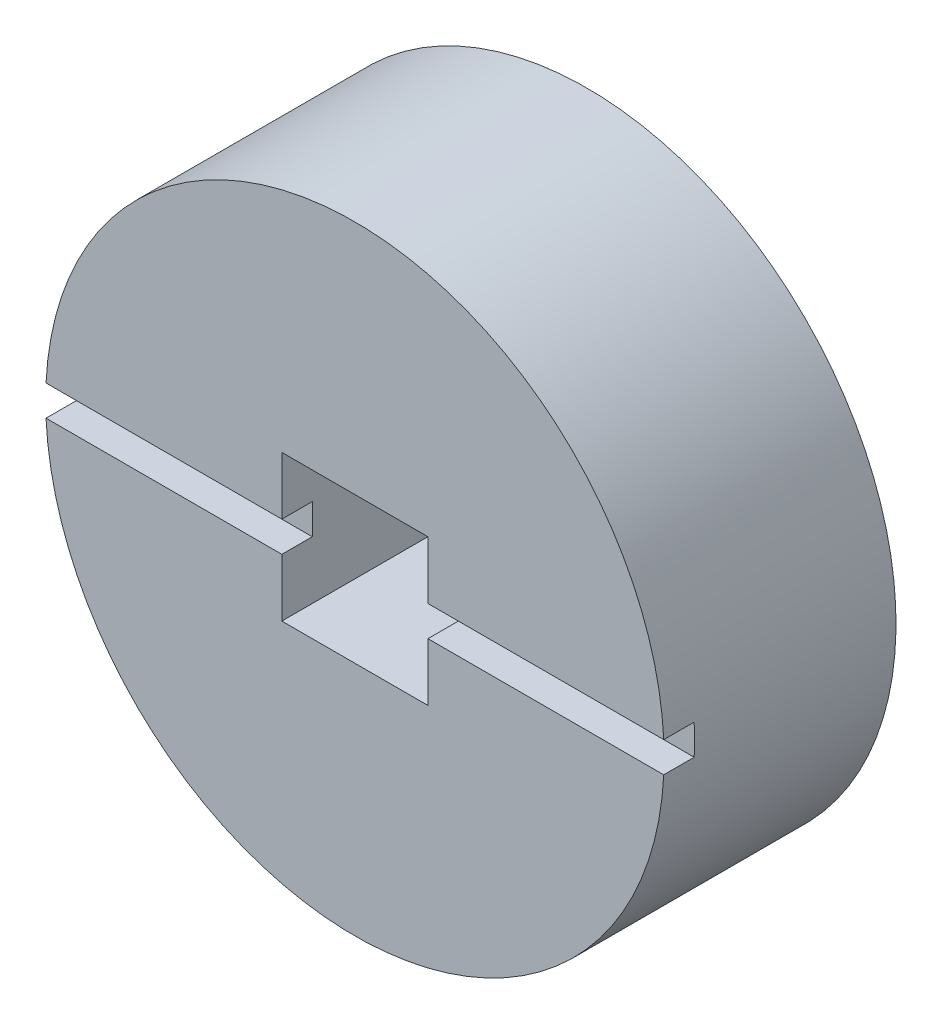
ISO-10303-21;
HEADER;
FILE_DESCRIPTION(('STEP AP214'),'2;1');
FILE_NAME('part.step','',(''),(''),'','','');
FILE_SCHEMA(('AUTOMOTIVE_DESIGN { 1 0 10303 214 1 1 1 1 }'));
ENDSEC;
DATA;
#1=APPLICATION_CONTEXT('core data for automotive mechanical design processes');
#2=APPLICATION_PROTOCOL_DEFINITION('international standard','automotive_design',2000,#1);
#3=PRODUCT_CONTEXT('',#1,'mechanical');
#4=PRODUCT('Part','Part','',(#3));
#5=PRODUCT_RELATED_PRODUCT_CATEGORY('part','',(#4));
#6=PRODUCT_DEFINITION_FORMATION('','',#4);
#7=PRODUCT_DEFINITION_CONTEXT('part definition',#1,'design');
#8=PRODUCT_DEFINITION('design','',#6,#7);
#9=PRODUCT_DEFINITION_SHAPE('','',#8);
#10=(LENGTH_UNIT() NAMED_UNIT(*) SI_UNIT(.MILLI.,.METRE.));
#11=(NAMED_UNIT(*) PLANE_ANGLE_UNIT() SI_UNIT($,.RADIAN.));
#12=(NAMED_UNIT(*) SI_UNIT($,.STERADIAN.) SOLID_ANGLE_UNIT());
#13=UNCERTAINTY_MEASURE_WITH_UNIT(LENGTH_MEASURE(1.E-05),#10,'distance_accuracy_value','');
#14=(GEOMETRIC_REPRESENTATION_CONTEXT(3) GLOBAL_UNCERTAINTY_ASSIGNED_CONTEXT((#13)) GLOBAL_UNIT_ASSIGNED_CONTEXT((#10,
#11,#12)) REPRESENTATION_CONTEXT('',''));
#15=CARTESIAN_POINT('',(0.,0.,0.));
#16=DIRECTION('',(0.,0.,1.));
#17=DIRECTION('',(1.,0.,0.));
#18=AXIS2_PLACEMENT_3D('',#15,#16,#17);
#19=CARTESIAN_POINT('',(119.725893556288,-5.54907958756384,-15.875));
#20=DIRECTION('',(0.,0.,1.));
#21=DIRECTION('',(1.,0.,0.));
#22=AXIS2_PLACEMENT_3D('',#19,#20,#21);
#23=PLANE('',#22);
#24=DIRECTION('',(1.,0.,0.));
#25=VECTOR('',#24,1.);
#26=CARTESIAN_POINT('',(109.859306675698,-5.79907958756384,-15.875));
#27=LINE('',#26,#25);
#28=CARTESIAN_POINT('',(114.652048860202,-5.79907958756384,-15.875));
#29=VERTEX_POINT('',#28);
#30=CARTESIAN_POINT('',(118.525893556288,-5.79907958756384,-15.875));
#31=VERTEX_POINT('',#30);
#32=EDGE_CURVE('E177',#29,#31,#27,.T.);
#33=ORIENTED_EDGE('',*,*,#32,.F.);
#34=CARTESIAN_POINT('',(119.725893556288,-5.54907958756384,-15.875));
#35=DIRECTION('',(0.,0.,1.));
#36=DIRECTION('',(1.,0.,0.));
#37=AXIS2_PLACEMENT_3D('',#34,#35,#36);
#38=CIRCLE('',#37,5.08);
#39=CARTESIAN_POINT('',(124.799738252374,-5.79907958756384,-15.875));
#40=VERTEX_POINT('',#39);
#41=EDGE_CURVE('E149',#29,#40,#38,.T.);
#42=ORIENTED_EDGE('',*,*,#41,.T.);
#43=CARTESIAN_POINT('',(120.925893556288,-5.79907958756384,-15.875));
#44=VERTEX_POINT('',#43);
#45=EDGE_CURVE('E140',#44,#40,#27,.T.);
#46=ORIENTED_EDGE('',*,*,#45,.F.);
#47=DIRECTION('',(0.,1.,0.));
#48=VECTOR('',#47,1.);
#49=CARTESIAN_POINT('',(120.925893556288,-4.34907958756384,-15.875));
#50=LINE('',#49,#48);
#51=CARTESIAN_POINT('',(120.925893556288,-6.74907958756384,-15.875));
#52=VERTEX_POINT('',#51);
#53=EDGE_CURVE('E205',#52,#44,#50,.T.);
#54=ORIENTED_EDGE('',*,*,#53,.F.);
#55=DIRECTION('',(1.,0.,0.));
#56=VECTOR('',#55,1.);
#57=CARTESIAN_POINT('',(118.525893556288,-6.74907958756384,-15.875));
#58=LINE('',#57,#56);
#59=CARTESIAN_POINT('',(118.525893556288,-6.74907958756384,-15.875));
#60=VERTEX_POINT('',#59);
#61=EDGE_CURVE('E196',#60,#52,#58,.T.);
#62=ORIENTED_EDGE('',*,*,#61,.F.);
#63=DIRECTION('',(0.,-1.,0.));
#64=VECTOR('',#63,1.);
#65=CARTESIAN_POINT('',(118.525893556288,-4.34907958756384,-15.875));
#66=LINE('',#65,#64);
#67=EDGE_CURVE('E211',#31,#60,#66,.T.);
#68=ORIENTED_EDGE('',*,*,#67,.F.);
#69=EDGE_LOOP('',(#33,#42,#46,#54,#62,#68));
#70=FACE_BOUND('',#69,.T.);
#71=ADVANCED_FACE('F33',(#70),#23,.T.);
#72=CARTESIAN_POINT('',(208.28,20.6375,-19.685));
#73=DIRECTION('',(0.,0.,-1.));
#74=DIRECTION('',(-1.,0.,0.));
#75=AXIS2_PLACEMENT_3D('',#72,#73,#74);
#76=PLANE('',#75);
#77=CARTESIAN_POINT('',(119.725893556288,-5.54907958756384,-19.685));
#78=DIRECTION('',(0.,0.,-1.));
#79=DIRECTION('',(-1.,0.,0.));
#80=AXIS2_PLACEMENT_3D('',#77,#78,#79);
#81=CIRCLE('',#80,5.08);
#82=CARTESIAN_POINT('',(114.645893556288,-5.54907958756384,-19.685));
#83=VERTEX_POINT('',#82);
#84=EDGE_CURVE('E148',#83,#83,#81,.F.);
#85=ORIENTED_EDGE('',*,*,#84,.F.);
#86=EDGE_LOOP('',(#85));
#87=FACE_BOUND('',#86,.T.);
#88=ADVANCED_FACE('F35',(#87),#76,.T.);
#89=DIRECTION('',(-1.,0.,0.));
#90=VECTOR('',#89,1.);
#91=CARTESIAN_POINT('',(109.859306675698,-5.29907958756384,-15.875));
#92=LINE('',#91,#90);
#93=CARTESIAN_POINT('',(124.799738252374,-5.29907958756384,-15.875));
#94=VERTEX_POINT('',#93);
#95=CARTESIAN_POINT('',(120.925893556288,-5.29907958756384,-15.875));
#96=VERTEX_POINT('',#95);
#97=EDGE_CURVE('E124',#94,#96,#92,.T.);
#98=ORIENTED_EDGE('',*,*,#97,.F.);
#99=CARTESIAN_POINT('',(114.652048860202,-5.29907958756384,-15.875));
#100=VERTEX_POINT('',#99);
#101=EDGE_CURVE('E137',#94,#100,#38,.T.);
#102=ORIENTED_EDGE('',*,*,#101,.T.);
#103=CARTESIAN_POINT('',(118.525893556288,-5.29907958756384,-15.875));
#104=VERTEX_POINT('',#103);
#105=EDGE_CURVE('E141',#104,#100,#92,.T.);
#106=ORIENTED_EDGE('',*,*,#105,.F.);
#107=CARTESIAN_POINT('',(118.525893556288,-4.34907958756384,-15.875));
#108=VERTEX_POINT('',#107);
#109=EDGE_CURVE('E166',#108,#104,#66,.T.);
#110=ORIENTED_EDGE('',*,*,#109,.F.);
#111=DIRECTION('',(-1.,0.,0.));
#112=VECTOR('',#111,1.);
#113=CARTESIAN_POINT('',(118.525893556288,-4.34907958756384,-15.875));
#114=LINE('',#113,#112);
#115=CARTESIAN_POINT('',(120.925893556288,-4.34907958756384,-15.875));
#116=VERTEX_POINT('',#115);
#117=EDGE_CURVE('E208',#116,#108,#114,.T.);
#118=ORIENTED_EDGE('',*,*,#117,.F.);
#119=EDGE_CURVE('E139',#96,#116,#50,.T.);
#120=ORIENTED_EDGE('',*,*,#119,.F.);
#121=EDGE_LOOP('',(#98,#102,#106,#110,#118,#120));
#122=FACE_BOUND('',#121,.T.);
#123=ADVANCED_FACE('F135',(#122),#23,.T.);
#124=CARTESIAN_POINT('',(119.725893556288,-5.54907958756384,-38.736540918157));
#125=DIRECTION('',(0.,0.,1.));
#126=DIRECTION('',(1.,0.,0.));
#127=AXIS2_PLACEMENT_3D('',#124,#125,#126);
#128=CYLINDRICAL_SURFACE('',#127,5.08);
#129=DIRECTION('',(0.,0.,1.));
#130=VECTOR('',#129,1.);
#131=CARTESIAN_POINT('',(114.652048860202,-5.79907958756384,-38.736540918157));
#132=LINE('',#131,#130);
#133=CARTESIAN_POINT('',(114.652048860202,-5.79907958756384,-16.375));
#134=VERTEX_POINT('',#133);
#135=EDGE_CURVE('E188',#134,#29,#132,.T.);
#136=ORIENTED_EDGE('',*,*,#135,.F.);
#137=CARTESIAN_POINT('',(119.725893556288,-5.54907958756384,-16.375));
#138=DIRECTION('',(0.,0.,1.));
#139=DIRECTION('',(1.,0.,0.));
#140=AXIS2_PLACEMENT_3D('',#137,#138,#139);
#141=CIRCLE('',#140,5.08);
#142=CARTESIAN_POINT('',(114.652048860202,-5.29907958756384,-16.375));
#143=VERTEX_POINT('',#142);
#144=EDGE_CURVE('E182',#134,#143,#141,.F.);
#145=ORIENTED_EDGE('',*,*,#144,.T.);
#146=DIRECTION('',(0.,0.,1.));
#147=VECTOR('',#146,1.);
#148=CARTESIAN_POINT('',(114.652048860202,-5.29907958756384,-38.736540918157));
#149=LINE('',#148,#147);
#150=EDGE_CURVE('E129',#100,#143,#149,.F.);
#151=ORIENTED_EDGE('',*,*,#150,.F.);
#152=ORIENTED_EDGE('',*,*,#101,.F.);
#153=DIRECTION('',(0.,0.,1.));
#154=VECTOR('',#153,1.);
#155=CARTESIAN_POINT('',(124.799738252374,-5.29907958756384,-38.736540918157));
#156=LINE('',#155,#154);
#157=CARTESIAN_POINT('',(124.799738252374,-5.29907958756384,-16.375));
#158=VERTEX_POINT('',#157);
#159=EDGE_CURVE('E121',#158,#94,#156,.T.);
#160=ORIENTED_EDGE('',*,*,#159,.F.);
#161=CARTESIAN_POINT('',(124.799738252374,-5.79907958756384,-16.375));
#162=VERTEX_POINT('',#161);
#163=EDGE_CURVE('E180',#158,#162,#141,.F.);
#164=ORIENTED_EDGE('',*,*,#163,.T.);
#165=DIRECTION('',(0.,0.,1.));
#166=VECTOR('',#165,1.);
#167=CARTESIAN_POINT('',(124.799738252374,-5.79907958756384,-38.736540918157));
#168=LINE('',#167,#166);
#169=EDGE_CURVE('E190',#40,#162,#168,.F.);
#170=ORIENTED_EDGE('',*,*,#169,.F.);
#171=ORIENTED_EDGE('',*,*,#41,.F.);
#172=EDGE_LOOP('',(#136,#145,#151,#152,#160,#164,#170,#171));
#173=FACE_BOUND('',#172,.T.);
#174=ORIENTED_EDGE('',*,*,#84,.T.);
#175=EDGE_LOOP('',(#174));
#176=FACE_BOUND('',#175,.T.);
#177=ADVANCED_FACE('F145',(#173,#176),#128,.T.);
#178=CARTESIAN_POINT('',(120.925893556288,-4.34907958756384,-18.796));
#179=DIRECTION('',(1.,0.,0.));
#180=DIRECTION('',(0.,1.,0.));
#181=AXIS2_PLACEMENT_3D('',#178,#179,#180);
#182=PLANE('',#181);
#183=ORIENTED_EDGE('',*,*,#53,.T.);
#184=DIRECTION('',(0.,0.,-1.));
#185=VECTOR('',#184,1.);
#186=CARTESIAN_POINT('',(120.925893556288,-5.79907958756384,-18.796));
#187=LINE('',#186,#185);
#188=CARTESIAN_POINT('',(120.925893556288,-5.79907958756384,-16.375));
#189=VERTEX_POINT('',#188);
#190=EDGE_CURVE('E185',#44,#189,#187,.T.);
#191=ORIENTED_EDGE('',*,*,#190,.T.);
#192=DIRECTION('',(0.,-1.,0.));
#193=VECTOR('',#192,1.);
#194=CARTESIAN_POINT('',(120.925893556288,-4.34907958756384,-16.375));
#195=LINE('',#194,#193);
#196=CARTESIAN_POINT('',(120.925893556288,-5.29907958756384,-16.375));
#197=VERTEX_POINT('',#196);
#198=EDGE_CURVE('E178',#197,#189,#195,.T.);
#199=ORIENTED_EDGE('',*,*,#198,.F.);
#200=DIRECTION('',(0.,0.,1.));
#201=VECTOR('',#200,1.);
#202=CARTESIAN_POINT('',(120.925893556288,-5.29907958756384,-18.796));
#203=LINE('',#202,#201);
#204=EDGE_CURVE('E130',#197,#96,#203,.T.);
#205=ORIENTED_EDGE('',*,*,#204,.T.);
#206=ORIENTED_EDGE('',*,*,#119,.T.);
#207=DIRECTION('',(0.,0.,1.));
#208=VECTOR('',#207,1.);
#209=CARTESIAN_POINT('',(120.925893556288,-4.34907958756384,-18.796));
#210=LINE('',#209,#208);
#211=CARTESIAN_POINT('',(120.925893556288,-4.34907958756384,-18.796));
#212=VERTEX_POINT('',#211);
#213=EDGE_CURVE('E157',#212,#116,#210,.T.);
#214=ORIENTED_EDGE('',*,*,#213,.F.);
#215=DIRECTION('',(0.,1.,0.));
#216=VECTOR('',#215,1.);
#217=CARTESIAN_POINT('',(120.925893556288,-4.34907958756384,-18.796));
#218=LINE('',#217,#216);
#219=CARTESIAN_POINT('',(120.925893556288,-6.74907958756384,-18.796));
#220=VERTEX_POINT('',#219);
#221=EDGE_CURVE('E192',#220,#212,#218,.T.);
#222=ORIENTED_EDGE('',*,*,#221,.F.);
#223=DIRECTION('',(0.,0.,1.));
#224=VECTOR('',#223,1.);
#225=CARTESIAN_POINT('',(120.925893556288,-6.74907958756384,-18.796));
#226=LINE('',#225,#224);
#227=EDGE_CURVE('E155',#220,#52,#226,.T.);
#228=ORIENTED_EDGE('',*,*,#227,.T.);
#229=EDGE_LOOP('',(#183,#191,#199,#205,#206,#214,#222,#228));
#230=FACE_BOUND('',#229,.T.);
#231=ADVANCED_FACE('F226',(#230),#182,.F.);
#232=CARTESIAN_POINT('',(118.525893556288,-6.74907958756384,-18.796));
#233=DIRECTION('',(0.,-1.,0.));
#234=DIRECTION('',(0.,0.,-1.));
#235=AXIS2_PLACEMENT_3D('',#232,#233,#234);
#236=PLANE('',#235);
#237=ORIENTED_EDGE('',*,*,#61,.T.);
#238=ORIENTED_EDGE('',*,*,#227,.F.);
#239=DIRECTION('',(1.,0.,0.));
#240=VECTOR('',#239,1.);
#241=CARTESIAN_POINT('',(118.525893556288,-6.74907958756384,-18.796));
#242=LINE('',#241,#240);
#243=CARTESIAN_POINT('',(118.525893556288,-6.74907958756384,-18.796));
#244=VERTEX_POINT('',#243);
#245=EDGE_CURVE('E202',#244,#220,#242,.T.);
#246=ORIENTED_EDGE('',*,*,#245,.F.);
#247=DIRECTION('',(0.,0.,1.));
#248=VECTOR('',#247,1.);
#249=CARTESIAN_POINT('',(118.525893556288,-6.74907958756384,-18.796));
#250=LINE('',#249,#248);
#251=EDGE_CURVE('E216',#244,#60,#250,.T.);
#252=ORIENTED_EDGE('',*,*,#251,.T.);
#253=EDGE_LOOP('',(#237,#238,#246,#252));
#254=FACE_BOUND('',#253,.T.);
#255=ADVANCED_FACE('F244',(#254),#236,.F.);
#256=CARTESIAN_POINT('',(118.525893556288,-4.34907958756384,-18.796));
#257=DIRECTION('',(-1.,0.,0.));
#258=DIRECTION('',(0.,0.,1.));
#259=AXIS2_PLACEMENT_3D('',#256,#257,#258);
#260=PLANE('',#259);
#261=DIRECTION('',(0.,1.,0.));
#262=VECTOR('',#261,1.);
#263=CARTESIAN_POINT('',(118.525893556288,-4.34907958756384,-16.375));
#264=LINE('',#263,#262);
#265=CARTESIAN_POINT('',(118.525893556288,-5.79907958756384,-16.375));
#266=VERTEX_POINT('',#265);
#267=CARTESIAN_POINT('',(118.525893556288,-5.29907958756384,-16.375));
#268=VERTEX_POINT('',#267);
#269=EDGE_CURVE('E152',#266,#268,#264,.T.);
#270=ORIENTED_EDGE('',*,*,#269,.F.);
#271=DIRECTION('',(0.,0.,1.));
#272=VECTOR('',#271,1.);
#273=CARTESIAN_POINT('',(118.525893556288,-5.79907958756384,-18.796));
#274=LINE('',#273,#272);
#275=EDGE_CURVE('E11',#266,#31,#274,.T.);
#276=ORIENTED_EDGE('',*,*,#275,.T.);
#277=ORIENTED_EDGE('',*,*,#67,.T.);
#278=ORIENTED_EDGE('',*,*,#251,.F.);
#279=DIRECTION('',(0.,-1.,0.));
#280=VECTOR('',#279,1.);
#281=CARTESIAN_POINT('',(118.525893556288,-4.34907958756384,-18.796));
#282=LINE('',#281,#280);
#283=CARTESIAN_POINT('',(118.525893556288,-4.34907958756384,-18.796));
#284=VERTEX_POINT('',#283);
#285=EDGE_CURVE('E199',#284,#244,#282,.T.);
#286=ORIENTED_EDGE('',*,*,#285,.F.);
#287=DIRECTION('',(0.,0.,1.));
#288=VECTOR('',#287,1.);
#289=CARTESIAN_POINT('',(118.525893556288,-4.34907958756384,-18.796));
#290=LINE('',#289,#288);
#291=EDGE_CURVE('E218',#284,#108,#290,.T.);
#292=ORIENTED_EDGE('',*,*,#291,.T.);
#293=ORIENTED_EDGE('',*,*,#109,.T.);
#294=DIRECTION('',(0.,0.,-1.));
#295=VECTOR('',#294,1.);
#296=CARTESIAN_POINT('',(118.525893556288,-5.29907958756384,-18.796));
#297=LINE('',#296,#295);
#298=EDGE_CURVE('E41',#104,#268,#297,.T.);
#299=ORIENTED_EDGE('',*,*,#298,.T.);
#300=EDGE_LOOP('',(#270,#276,#277,#278,#286,#292,#293,#299));
#301=FACE_BOUND('',#300,.T.);
#302=ADVANCED_FACE('F164',(#301),#260,.F.);
#303=CARTESIAN_POINT('',(118.525893556288,-4.34907958756384,-18.796));
#304=DIRECTION('',(0.,1.,0.));
#305=DIRECTION('',(0.,0.,1.));
#306=AXIS2_PLACEMENT_3D('',#303,#304,#305);
#307=PLANE('',#306);
#308=ORIENTED_EDGE('',*,*,#117,.T.);
#309=ORIENTED_EDGE('',*,*,#291,.F.);
#310=DIRECTION('',(-1.,0.,0.));
#311=VECTOR('',#310,1.);
#312=CARTESIAN_POINT('',(118.525893556288,-4.34907958756384,-18.796));
#313=LINE('',#312,#311);
#314=EDGE_CURVE('E195',#212,#284,#313,.T.);
#315=ORIENTED_EDGE('',*,*,#314,.F.);
#316=ORIENTED_EDGE('',*,*,#213,.T.);
#317=EDGE_LOOP('',(#308,#309,#315,#316));
#318=FACE_BOUND('',#317,.T.);
#319=ADVANCED_FACE('F223',(#318),#307,.F.);
#320=CARTESIAN_POINT('',(0.,0.,-18.796));
#321=DIRECTION('',(0.,0.,1.));
#322=DIRECTION('',(1.,0.,0.));
#323=AXIS2_PLACEMENT_3D('',#320,#321,#322);
#324=PLANE('',#323);
#325=ORIENTED_EDGE('',*,*,#221,.T.);
#326=ORIENTED_EDGE('',*,*,#314,.T.);
#327=ORIENTED_EDGE('',*,*,#285,.T.);
#328=ORIENTED_EDGE('',*,*,#245,.T.);
#329=EDGE_LOOP('',(#325,#326,#327,#328));
#330=FACE_BOUND('',#329,.T.);
#331=ADVANCED_FACE('F247',(#330),#324,.T.);
#332=CARTESIAN_POINT('',(0.,0.,-16.375));
#333=DIRECTION('',(0.,0.,1.));
#334=DIRECTION('',(1.,0.,0.));
#335=AXIS2_PLACEMENT_3D('',#332,#333,#334);
#336=PLANE('',#335);
#337=DIRECTION('',(1.,0.,0.));
#338=VECTOR('',#337,1.);
#339=CARTESIAN_POINT('',(109.859306675698,-5.79907958756384,-16.375));
#340=LINE('',#339,#338);
#341=EDGE_CURVE('E56',#134,#266,#340,.T.);
#342=ORIENTED_EDGE('',*,*,#341,.T.);
#343=ORIENTED_EDGE('',*,*,#269,.T.);
#344=DIRECTION('',(-1.,0.,0.));
#345=VECTOR('',#344,1.);
#346=CARTESIAN_POINT('',(109.859306675698,-5.29907958756384,-16.375));
#347=LINE('',#346,#345);
#348=EDGE_CURVE('E171',#268,#143,#347,.T.);
#349=ORIENTED_EDGE('',*,*,#348,.T.);
#350=ORIENTED_EDGE('',*,*,#144,.F.);
#351=EDGE_LOOP('',(#342,#343,#349,#350));
#352=FACE_BOUND('',#351,.T.);
#353=ADVANCED_FACE('F249',(#352),#336,.T.);
#354=CARTESIAN_POINT('',(109.859306675698,-5.29907958756384,-16.375));
#355=DIRECTION('',(0.,1.,0.));
#356=DIRECTION('',(0.,0.,1.));
#357=AXIS2_PLACEMENT_3D('',#354,#355,#356);
#358=PLANE('',#357);
#359=ORIENTED_EDGE('',*,*,#150,.T.);
#360=ORIENTED_EDGE('',*,*,#348,.F.);
#361=ORIENTED_EDGE('',*,*,#298,.F.);
#362=ORIENTED_EDGE('',*,*,#105,.T.);
#363=EDGE_LOOP('',(#359,#360,#361,#362));
#364=FACE_BOUND('',#363,.T.);
#365=ADVANCED_FACE('F169',(#364),#358,.F.);
#366=CARTESIAN_POINT('',(109.859306675698,-5.79907958756384,-16.375));
#367=DIRECTION('',(0.,-1.,0.));
#368=DIRECTION('',(0.,0.,-1.));
#369=AXIS2_PLACEMENT_3D('',#366,#367,#368);
#370=PLANE('',#369);
#371=ORIENTED_EDGE('',*,*,#135,.T.);
#372=ORIENTED_EDGE('',*,*,#32,.T.);
#373=ORIENTED_EDGE('',*,*,#275,.F.);
#374=ORIENTED_EDGE('',*,*,#341,.F.);
#375=EDGE_LOOP('',(#371,#372,#373,#374));
#376=FACE_BOUND('',#375,.T.);
#377=ADVANCED_FACE('F237',(#376),#370,.F.);
#378=ORIENTED_EDGE('',*,*,#169,.T.);
#379=EDGE_CURVE('E174',#189,#162,#340,.T.);
#380=ORIENTED_EDGE('',*,*,#379,.F.);
#381=ORIENTED_EDGE('',*,*,#190,.F.);
#382=ORIENTED_EDGE('',*,*,#45,.T.);
#383=EDGE_LOOP('',(#378,#380,#381,#382));
#384=FACE_BOUND('',#383,.T.);
#385=ADVANCED_FACE('F232',(#384),#370,.F.);
#386=ORIENTED_EDGE('',*,*,#159,.T.);
#387=ORIENTED_EDGE('',*,*,#97,.T.);
#388=ORIENTED_EDGE('',*,*,#204,.F.);
#389=EDGE_CURVE('E48',#158,#197,#347,.T.);
#390=ORIENTED_EDGE('',*,*,#389,.F.);
#391=EDGE_LOOP('',(#386,#387,#388,#390));
#392=FACE_BOUND('',#391,.T.);
#393=ADVANCED_FACE('F123',(#392),#358,.F.);
#394=ORIENTED_EDGE('',*,*,#389,.T.);
#395=ORIENTED_EDGE('',*,*,#198,.T.);
#396=ORIENTED_EDGE('',*,*,#379,.T.);
#397=ORIENTED_EDGE('',*,*,#163,.F.);
#398=EDGE_LOOP('',(#394,#395,#396,#397));
#399=FACE_BOUND('',#398,.T.);
#400=ADVANCED_FACE('F230',(#399),#336,.T.);
#401=CLOSED_SHELL('',(#71,#88,#123,#177,#231,#255,#302,#319,#331,#353,#365,#377,#385,#393,#400));
#402=MANIFOLD_SOLID_BREP('B2',#401);
#403=ADVANCED_BREP_SHAPE_REPRESENTATION('',(#18,#402),#14);
#404=SHAPE_DEFINITION_REPRESENTATION(#9,#403);
ENDSEC;
END-ISO-10303-21;
